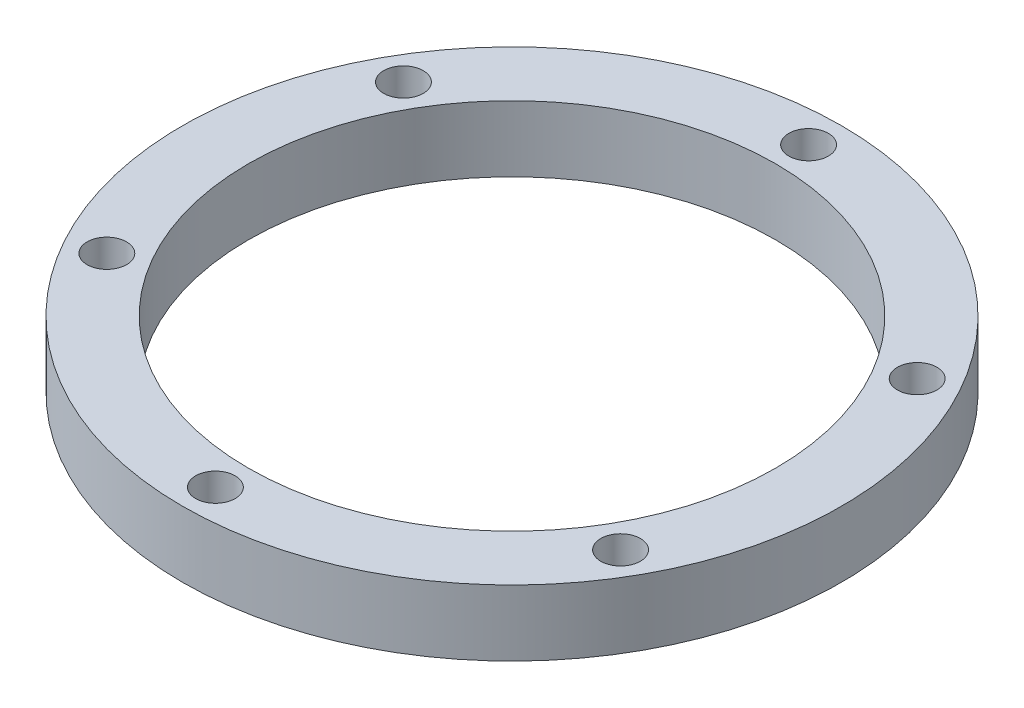
ISO-10303-21;
HEADER;
FILE_DESCRIPTION(('STEP AP214'),'2;1');
FILE_NAME('part.step','',(''),(''),'','','');
FILE_SCHEMA(('AUTOMOTIVE_DESIGN { 1 0 10303 214 1 1 1 1 }'));
ENDSEC;
DATA;
#1=APPLICATION_CONTEXT('core data for automotive mechanical design processes');
#2=APPLICATION_PROTOCOL_DEFINITION('international standard','automotive_design',2000,#1);
#3=PRODUCT_CONTEXT('',#1,'mechanical');
#4=PRODUCT('Part','Part','',(#3));
#5=PRODUCT_RELATED_PRODUCT_CATEGORY('part','',(#4));
#6=PRODUCT_DEFINITION_FORMATION('','',#4);
#7=PRODUCT_DEFINITION_CONTEXT('part definition',#1,'design');
#8=PRODUCT_DEFINITION('design','',#6,#7);
#9=PRODUCT_DEFINITION_SHAPE('','',#8);
#10=(LENGTH_UNIT() NAMED_UNIT(*) SI_UNIT(.MILLI.,.METRE.));
#11=(NAMED_UNIT(*) PLANE_ANGLE_UNIT() SI_UNIT($,.RADIAN.));
#12=(NAMED_UNIT(*) SI_UNIT($,.STERADIAN.) SOLID_ANGLE_UNIT());
#13=UNCERTAINTY_MEASURE_WITH_UNIT(LENGTH_MEASURE(1.E-05),#10,'distance_accuracy_value','');
#14=(GEOMETRIC_REPRESENTATION_CONTEXT(3) GLOBAL_UNCERTAINTY_ASSIGNED_CONTEXT((#13)) GLOBAL_UNIT_ASSIGNED_CONTEXT((#10,
#11,#12)) REPRESENTATION_CONTEXT('',''));
#15=CARTESIAN_POINT('',(0.,0.,0.));
#16=DIRECTION('',(0.,0.,1.));
#17=DIRECTION('',(1.,0.,0.));
#18=AXIS2_PLACEMENT_3D('',#15,#16,#17);
#19=CARTESIAN_POINT('',(0.,10.,0.));
#20=DIRECTION('',(0.,1.,0.));
#21=DIRECTION('',(0.,0.,1.));
#22=AXIS2_PLACEMENT_3D('',#19,#20,#21);
#23=PLANE('',#22);
#24=CARTESIAN_POINT('',(-38.9711431703,10.,-22.4999999999996));
#25=DIRECTION('',(0.,1.,0.));
#26=DIRECTION('',(0.,0.,1.));
#27=AXIS2_PLACEMENT_3D('',#24,#25,#26);
#28=CIRCLE('',#27,3.);
#29=CARTESIAN_POINT('',(-38.9711431703,10.,-19.4999999999996));
#30=VERTEX_POINT('',#29);
#31=EDGE_CURVE('E104',#30,#30,#28,.T.);
#32=ORIENTED_EDGE('',*,*,#31,.F.);
#33=EDGE_LOOP('',(#32));
#34=FACE_BOUND('',#33,.T.);
#35=CARTESIAN_POINT('',(-38.9711431702996,10.,22.5000000000002));
#36=DIRECTION('',(0.,1.,0.));
#37=DIRECTION('',(0.,0.,1.));
#38=AXIS2_PLACEMENT_3D('',#35,#36,#37);
#39=CIRCLE('',#38,3.);
#40=CARTESIAN_POINT('',(-38.9711431702996,10.,25.5000000000002));
#41=VERTEX_POINT('',#40);
#42=EDGE_CURVE('E108',#41,#41,#39,.T.);
#43=ORIENTED_EDGE('',*,*,#42,.F.);
#44=EDGE_LOOP('',(#43));
#45=FACE_BOUND('',#44,.T.);
#46=CARTESIAN_POINT('',(0.,10.,45.));
#47=DIRECTION('',(0.,1.,0.));
#48=DIRECTION('',(0.,0.,1.));
#49=AXIS2_PLACEMENT_3D('',#46,#47,#48);
#50=CIRCLE('',#49,3.);
#51=CARTESIAN_POINT('',(0.,10.,48.));
#52=VERTEX_POINT('',#51);
#53=EDGE_CURVE('E112',#52,#52,#50,.T.);
#54=ORIENTED_EDGE('',*,*,#53,.F.);
#55=EDGE_LOOP('',(#54));
#56=FACE_BOUND('',#55,.T.);
#57=CARTESIAN_POINT('',(0.,10.,-45.));
#58=DIRECTION('',(0.,1.,0.));
#59=DIRECTION('',(0.,0.,1.));
#60=AXIS2_PLACEMENT_3D('',#57,#58,#59);
#61=CIRCLE('',#60,3.);
#62=CARTESIAN_POINT('',(0.,10.,-42.));
#63=VERTEX_POINT('',#62);
#64=EDGE_CURVE('E74',#63,#63,#61,.T.);
#65=ORIENTED_EDGE('',*,*,#64,.F.);
#66=EDGE_LOOP('',(#65));
#67=FACE_BOUND('',#66,.T.);
#68=CARTESIAN_POINT('',(38.9711431703,10.,22.4999999999996));
#69=DIRECTION('',(0.,1.,0.));
#70=DIRECTION('',(0.,0.,1.));
#71=AXIS2_PLACEMENT_3D('',#68,#69,#70);
#72=CIRCLE('',#71,3.);
#73=CARTESIAN_POINT('',(38.9711431703,10.,25.4999999999996));
#74=VERTEX_POINT('',#73);
#75=EDGE_CURVE('E57',#74,#74,#72,.T.);
#76=ORIENTED_EDGE('',*,*,#75,.F.);
#77=EDGE_LOOP('',(#76));
#78=FACE_BOUND('',#77,.T.);
#79=CARTESIAN_POINT('',(38.9711431702996,10.,-22.5000000000002));
#80=DIRECTION('',(0.,1.,0.));
#81=DIRECTION('',(0.,0.,1.));
#82=AXIS2_PLACEMENT_3D('',#79,#80,#81);
#83=CIRCLE('',#82,3.);
#84=CARTESIAN_POINT('',(38.9711431702996,10.,-19.5000000000002));
#85=VERTEX_POINT('',#84);
#86=EDGE_CURVE('E52',#85,#85,#83,.T.);
#87=ORIENTED_EDGE('',*,*,#86,.F.);
#88=EDGE_LOOP('',(#87));
#89=FACE_BOUND('',#88,.T.);
#90=CARTESIAN_POINT('',(0.,10.,0.));
#91=DIRECTION('',(0.,1.,0.));
#92=DIRECTION('',(0.,0.,1.));
#93=AXIS2_PLACEMENT_3D('',#90,#91,#92);
#94=CIRCLE('',#93,50.);
#95=CARTESIAN_POINT('',(0.,10.,50.));
#96=VERTEX_POINT('',#95);
#97=EDGE_CURVE('E10',#96,#96,#94,.T.);
#98=ORIENTED_EDGE('',*,*,#97,.T.);
#99=EDGE_LOOP('',(#98));
#100=FACE_BOUND('',#99,.T.);
#101=CARTESIAN_POINT('',(0.,10.,0.));
#102=DIRECTION('',(0.,1.,0.));
#103=DIRECTION('',(0.,0.,1.));
#104=AXIS2_PLACEMENT_3D('',#101,#102,#103);
#105=CIRCLE('',#104,40.);
#106=CARTESIAN_POINT('',(0.,10.,40.));
#107=VERTEX_POINT('',#106);
#108=EDGE_CURVE('E43',#107,#107,#105,.T.);
#109=ORIENTED_EDGE('',*,*,#108,.F.);
#110=EDGE_LOOP('',(#109));
#111=FACE_BOUND('',#110,.T.);
#112=ADVANCED_FACE('F30',(#34,#45,#56,#67,#78,#89,#100,#111),#23,.T.);
#113=CARTESIAN_POINT('',(0.,0.,0.));
#114=DIRECTION('',(0.,1.,0.));
#115=DIRECTION('',(0.,0.,1.));
#116=AXIS2_PLACEMENT_3D('',#113,#114,#115);
#117=PLANE('',#116);
#118=CARTESIAN_POINT('',(-38.9711431703,0.,-22.4999999999996));
#119=DIRECTION('',(0.,1.,0.));
#120=DIRECTION('',(0.,0.,1.));
#121=AXIS2_PLACEMENT_3D('',#118,#119,#120);
#122=CIRCLE('',#121,3.);
#123=CARTESIAN_POINT('',(-38.9711431703,0.,-19.4999999999996));
#124=VERTEX_POINT('',#123);
#125=EDGE_CURVE('E34',#124,#124,#122,.T.);
#126=ORIENTED_EDGE('',*,*,#125,.T.);
#127=EDGE_LOOP('',(#126));
#128=FACE_BOUND('',#127,.T.);
#129=CARTESIAN_POINT('',(-38.9711431702996,0.,22.5000000000002));
#130=DIRECTION('',(0.,1.,0.));
#131=DIRECTION('',(0.,0.,1.));
#132=AXIS2_PLACEMENT_3D('',#129,#130,#131);
#133=CIRCLE('',#132,3.);
#134=CARTESIAN_POINT('',(-38.9711431702996,0.,25.5000000000002));
#135=VERTEX_POINT('',#134);
#136=EDGE_CURVE('E62',#135,#135,#133,.T.);
#137=ORIENTED_EDGE('',*,*,#136,.T.);
#138=EDGE_LOOP('',(#137));
#139=FACE_BOUND('',#138,.T.);
#140=CARTESIAN_POINT('',(0.,0.,45.));
#141=DIRECTION('',(0.,1.,0.));
#142=DIRECTION('',(0.,0.,1.));
#143=AXIS2_PLACEMENT_3D('',#140,#141,#142);
#144=CIRCLE('',#143,3.);
#145=CARTESIAN_POINT('',(0.,0.,48.));
#146=VERTEX_POINT('',#145);
#147=EDGE_CURVE('E60',#146,#146,#144,.T.);
#148=ORIENTED_EDGE('',*,*,#147,.T.);
#149=EDGE_LOOP('',(#148));
#150=FACE_BOUND('',#149,.T.);
#151=CARTESIAN_POINT('',(0.,0.,-45.));
#152=DIRECTION('',(0.,1.,0.));
#153=DIRECTION('',(0.,0.,1.));
#154=AXIS2_PLACEMENT_3D('',#151,#152,#153);
#155=CIRCLE('',#154,3.);
#156=CARTESIAN_POINT('',(0.,0.,-42.));
#157=VERTEX_POINT('',#156);
#158=EDGE_CURVE('E56',#157,#157,#155,.T.);
#159=ORIENTED_EDGE('',*,*,#158,.T.);
#160=EDGE_LOOP('',(#159));
#161=FACE_BOUND('',#160,.T.);
#162=CARTESIAN_POINT('',(38.9711431703,0.,22.4999999999996));
#163=DIRECTION('',(0.,1.,0.));
#164=DIRECTION('',(0.,0.,1.));
#165=AXIS2_PLACEMENT_3D('',#162,#163,#164);
#166=CIRCLE('',#165,3.);
#167=CARTESIAN_POINT('',(38.9711431703,0.,25.4999999999996));
#168=VERTEX_POINT('',#167);
#169=EDGE_CURVE('E53',#168,#168,#166,.T.);
#170=ORIENTED_EDGE('',*,*,#169,.T.);
#171=EDGE_LOOP('',(#170));
#172=FACE_BOUND('',#171,.T.);
#173=CARTESIAN_POINT('',(38.9711431702996,0.,-22.5000000000002));
#174=DIRECTION('',(0.,1.,0.));
#175=DIRECTION('',(0.,0.,1.));
#176=AXIS2_PLACEMENT_3D('',#173,#174,#175);
#177=CIRCLE('',#176,3.);
#178=CARTESIAN_POINT('',(38.9711431702996,0.,-19.5000000000002));
#179=VERTEX_POINT('',#178);
#180=EDGE_CURVE('E49',#179,#179,#177,.T.);
#181=ORIENTED_EDGE('',*,*,#180,.T.);
#182=EDGE_LOOP('',(#181));
#183=FACE_BOUND('',#182,.T.);
#184=CARTESIAN_POINT('',(0.,0.,0.));
#185=DIRECTION('',(0.,1.,0.));
#186=DIRECTION('',(0.,0.,1.));
#187=AXIS2_PLACEMENT_3D('',#184,#185,#186);
#188=CIRCLE('',#187,50.);
#189=CARTESIAN_POINT('',(0.,0.,50.));
#190=VERTEX_POINT('',#189);
#191=EDGE_CURVE('E38',#190,#190,#188,.T.);
#192=ORIENTED_EDGE('',*,*,#191,.F.);
#193=EDGE_LOOP('',(#192));
#194=FACE_BOUND('',#193,.T.);
#195=CARTESIAN_POINT('',(0.,0.,0.));
#196=DIRECTION('',(0.,1.,0.));
#197=DIRECTION('',(0.,0.,1.));
#198=AXIS2_PLACEMENT_3D('',#195,#196,#197);
#199=CIRCLE('',#198,40.);
#200=CARTESIAN_POINT('',(0.,0.,40.));
#201=VERTEX_POINT('',#200);
#202=EDGE_CURVE('E46',#201,#201,#199,.T.);
#203=ORIENTED_EDGE('',*,*,#202,.T.);
#204=EDGE_LOOP('',(#203));
#205=FACE_BOUND('',#204,.T.);
#206=ADVANCED_FACE('F82',(#128,#139,#150,#161,#172,#183,#194,#205),#117,.F.);
#207=CARTESIAN_POINT('',(0.,10.,0.));
#208=DIRECTION('',(0.,-1.,0.));
#209=DIRECTION('',(0.,0.,-1.));
#210=AXIS2_PLACEMENT_3D('',#207,#208,#209);
#211=CYLINDRICAL_SURFACE('',#210,50.);
#212=ORIENTED_EDGE('',*,*,#97,.F.);
#213=EDGE_LOOP('',(#212));
#214=FACE_BOUND('',#213,.T.);
#215=ORIENTED_EDGE('',*,*,#191,.T.);
#216=EDGE_LOOP('',(#215));
#217=FACE_BOUND('',#216,.T.);
#218=ADVANCED_FACE('F32',(#214,#217),#211,.T.);
#219=CARTESIAN_POINT('',(0.,10.,0.));
#220=DIRECTION('',(0.,-1.,0.));
#221=DIRECTION('',(0.,0.,-1.));
#222=AXIS2_PLACEMENT_3D('',#219,#220,#221);
#223=CYLINDRICAL_SURFACE('',#222,40.);
#224=ORIENTED_EDGE('',*,*,#108,.T.);
#225=EDGE_LOOP('',(#224));
#226=FACE_BOUND('',#225,.T.);
#227=ORIENTED_EDGE('',*,*,#202,.F.);
#228=EDGE_LOOP('',(#227));
#229=FACE_BOUND('',#228,.T.);
#230=ADVANCED_FACE('F84',(#226,#229),#223,.F.);
#231=CARTESIAN_POINT('',(38.9711431702996,-28.,-22.5000000000002));
#232=DIRECTION('',(0.,1.,0.));
#233=DIRECTION('',(0.,0.,1.));
#234=AXIS2_PLACEMENT_3D('',#231,#232,#233);
#235=CYLINDRICAL_SURFACE('',#234,3.);
#236=ORIENTED_EDGE('',*,*,#86,.T.);
#237=EDGE_LOOP('',(#236));
#238=FACE_BOUND('',#237,.T.);
#239=ORIENTED_EDGE('',*,*,#180,.F.);
#240=EDGE_LOOP('',(#239));
#241=FACE_BOUND('',#240,.T.);
#242=ADVANCED_FACE('F86',(#238,#241),#235,.F.);
#243=CARTESIAN_POINT('',(38.9711431703,-28.,22.4999999999996));
#244=DIRECTION('',(0.,1.,0.));
#245=DIRECTION('',(0.,0.,1.));
#246=AXIS2_PLACEMENT_3D('',#243,#244,#245);
#247=CYLINDRICAL_SURFACE('',#246,3.);
#248=ORIENTED_EDGE('',*,*,#75,.T.);
#249=EDGE_LOOP('',(#248));
#250=FACE_BOUND('',#249,.T.);
#251=ORIENTED_EDGE('',*,*,#169,.F.);
#252=EDGE_LOOP('',(#251));
#253=FACE_BOUND('',#252,.T.);
#254=ADVANCED_FACE('F92',(#250,#253),#247,.F.);
#255=CARTESIAN_POINT('',(0.,-28.,-45.));
#256=DIRECTION('',(0.,1.,0.));
#257=DIRECTION('',(0.,0.,1.));
#258=AXIS2_PLACEMENT_3D('',#255,#256,#257);
#259=CYLINDRICAL_SURFACE('',#258,3.);
#260=ORIENTED_EDGE('',*,*,#64,.T.);
#261=EDGE_LOOP('',(#260));
#262=FACE_BOUND('',#261,.T.);
#263=ORIENTED_EDGE('',*,*,#158,.F.);
#264=EDGE_LOOP('',(#263));
#265=FACE_BOUND('',#264,.T.);
#266=ADVANCED_FACE('F129',(#262,#265),#259,.F.);
#267=CARTESIAN_POINT('',(0.,-28.,45.));
#268=DIRECTION('',(0.,1.,0.));
#269=DIRECTION('',(0.,0.,1.));
#270=AXIS2_PLACEMENT_3D('',#267,#268,#269);
#271=CYLINDRICAL_SURFACE('',#270,3.);
#272=ORIENTED_EDGE('',*,*,#53,.T.);
#273=EDGE_LOOP('',(#272));
#274=FACE_BOUND('',#273,.T.);
#275=ORIENTED_EDGE('',*,*,#147,.F.);
#276=EDGE_LOOP('',(#275));
#277=FACE_BOUND('',#276,.T.);
#278=ADVANCED_FACE('F125',(#274,#277),#271,.F.);
#279=CARTESIAN_POINT('',(-38.9711431702996,-28.,22.5000000000002));
#280=DIRECTION('',(0.,1.,0.));
#281=DIRECTION('',(0.,0.,1.));
#282=AXIS2_PLACEMENT_3D('',#279,#280,#281);
#283=CYLINDRICAL_SURFACE('',#282,3.);
#284=ORIENTED_EDGE('',*,*,#42,.T.);
#285=EDGE_LOOP('',(#284));
#286=FACE_BOUND('',#285,.T.);
#287=ORIENTED_EDGE('',*,*,#136,.F.);
#288=EDGE_LOOP('',(#287));
#289=FACE_BOUND('',#288,.T.);
#290=ADVANCED_FACE('F128',(#286,#289),#283,.F.);
#291=CARTESIAN_POINT('',(-38.9711431703,-28.,-22.4999999999996));
#292=DIRECTION('',(0.,1.,0.));
#293=DIRECTION('',(0.,0.,1.));
#294=AXIS2_PLACEMENT_3D('',#291,#292,#293);
#295=CYLINDRICAL_SURFACE('',#294,3.);
#296=ORIENTED_EDGE('',*,*,#31,.T.);
#297=EDGE_LOOP('',(#296));
#298=FACE_BOUND('',#297,.T.);
#299=ORIENTED_EDGE('',*,*,#125,.F.);
#300=EDGE_LOOP('',(#299));
#301=FACE_BOUND('',#300,.T.);
#302=ADVANCED_FACE('F152',(#298,#301),#295,.F.);
#303=CLOSED_SHELL('',(#112,#206,#218,#230,#242,#254,#266,#278,#290,#302));
#304=MANIFOLD_SOLID_BREP('B2',#303);
#305=ADVANCED_BREP_SHAPE_REPRESENTATION('',(#18,#304),#14);
#306=SHAPE_DEFINITION_REPRESENTATION(#9,#305);
ENDSEC;
END-ISO-10303-21;
